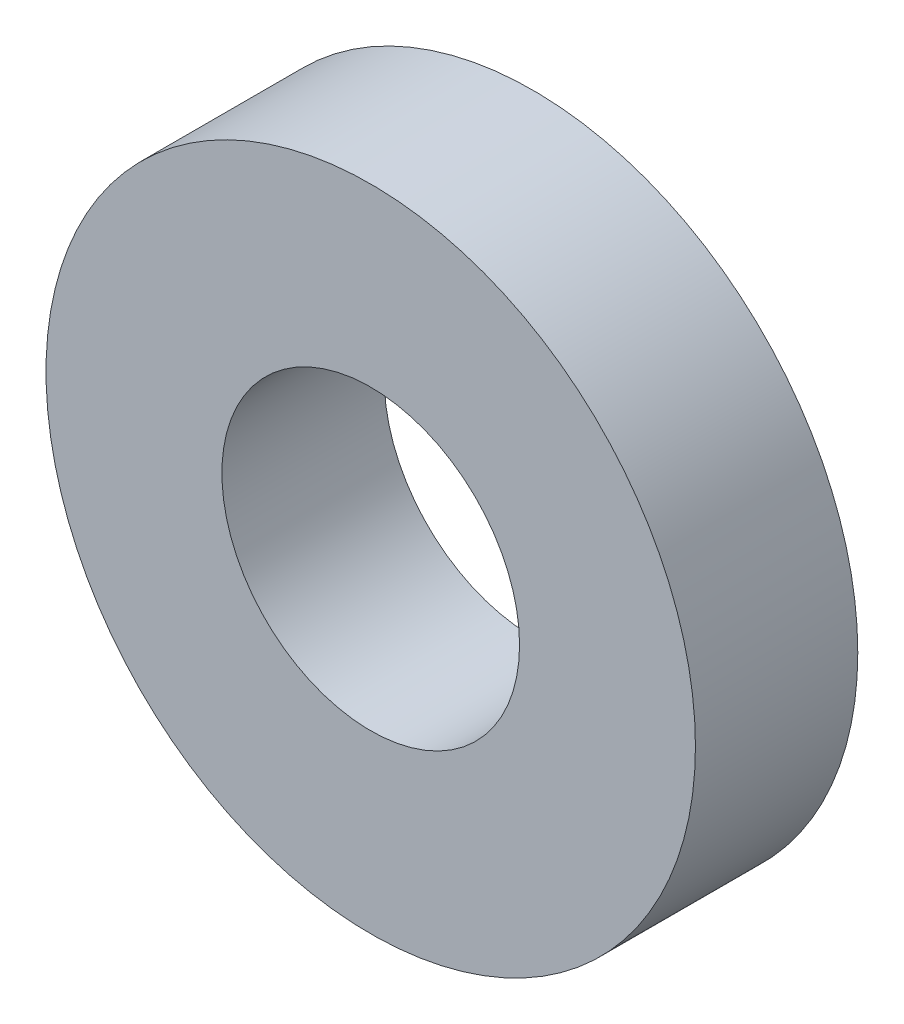
ISO-10303-21;
HEADER;
FILE_DESCRIPTION(('STEP AP214'),'2;1');
FILE_NAME('part.step','',(''),(''),'','','');
FILE_SCHEMA(('AUTOMOTIVE_DESIGN { 1 0 10303 214 1 1 1 1 }'));
ENDSEC;
DATA;
#1=APPLICATION_CONTEXT('core data for automotive mechanical design processes');
#2=APPLICATION_PROTOCOL_DEFINITION('international standard','automotive_design',2000,#1);
#3=PRODUCT_CONTEXT('',#1,'mechanical');
#4=PRODUCT('Part','Part','',(#3));
#5=PRODUCT_RELATED_PRODUCT_CATEGORY('part','',(#4));
#6=PRODUCT_DEFINITION_FORMATION('','',#4);
#7=PRODUCT_DEFINITION_CONTEXT('part definition',#1,'design');
#8=PRODUCT_DEFINITION('design','',#6,#7);
#9=PRODUCT_DEFINITION_SHAPE('','',#8);
#10=(LENGTH_UNIT() NAMED_UNIT(*) SI_UNIT(.MILLI.,.METRE.));
#11=(NAMED_UNIT(*) PLANE_ANGLE_UNIT() SI_UNIT($,.RADIAN.));
#12=(NAMED_UNIT(*) SI_UNIT($,.STERADIAN.) SOLID_ANGLE_UNIT());
#13=UNCERTAINTY_MEASURE_WITH_UNIT(LENGTH_MEASURE(1.E-05),#10,'distance_accuracy_value','');
#14=(GEOMETRIC_REPRESENTATION_CONTEXT(3) GLOBAL_UNCERTAINTY_ASSIGNED_CONTEXT((#13)) GLOBAL_UNIT_ASSIGNED_CONTEXT((#10,
#11,#12)) REPRESENTATION_CONTEXT('',''));
#15=CARTESIAN_POINT('',(0.,0.,0.));
#16=DIRECTION('',(0.,0.,1.));
#17=DIRECTION('',(1.,0.,0.));
#18=AXIS2_PLACEMENT_3D('',#15,#16,#17);
#19=CARTESIAN_POINT('',(0.,0.,12.));
#20=DIRECTION('',(0.,0.,-1.));
#21=DIRECTION('',(-1.,0.,0.));
#22=AXIS2_PLACEMENT_3D('',#19,#20,#21);
#23=CYLINDRICAL_SURFACE('',#22,24.);
#24=CARTESIAN_POINT('',(0.,0.,12.));
#25=DIRECTION('',(0.,0.,1.));
#26=DIRECTION('',(1.,0.,0.));
#27=AXIS2_PLACEMENT_3D('',#24,#25,#26);
#28=CIRCLE('',#27,24.);
#29=CARTESIAN_POINT('',(24.,0.,12.));
#30=VERTEX_POINT('',#29);
#31=EDGE_CURVE('E10',#30,#30,#28,.T.);
#32=ORIENTED_EDGE('',*,*,#31,.F.);
#33=EDGE_LOOP('',(#32));
#34=FACE_BOUND('',#33,.T.);
#35=CARTESIAN_POINT('',(0.,0.,0.));
#36=DIRECTION('',(0.,0.,1.));
#37=DIRECTION('',(1.,0.,0.));
#38=AXIS2_PLACEMENT_3D('',#35,#36,#37);
#39=CIRCLE('',#38,24.);
#40=CARTESIAN_POINT('',(24.,0.,0.));
#41=VERTEX_POINT('',#40);
#42=EDGE_CURVE('E40',#41,#41,#39,.T.);
#43=ORIENTED_EDGE('',*,*,#42,.T.);
#44=EDGE_LOOP('',(#43));
#45=FACE_BOUND('',#44,.T.);
#46=ADVANCED_FACE('F37',(#34,#45),#23,.T.);
#47=CARTESIAN_POINT('',(0.,0.,12.));
#48=DIRECTION('',(0.,0.,1.));
#49=DIRECTION('',(1.,0.,0.));
#50=AXIS2_PLACEMENT_3D('',#47,#48,#49);
#51=PLANE('',#50);
#52=CARTESIAN_POINT('',(0.,0.,12.));
#53=DIRECTION('',(0.,0.,1.));
#54=DIRECTION('',(1.,0.,0.));
#55=AXIS2_PLACEMENT_3D('',#52,#53,#54);
#56=CIRCLE('',#55,11.);
#57=CARTESIAN_POINT('',(11.,0.,12.));
#58=VERTEX_POINT('',#57);
#59=EDGE_CURVE('E49',#58,#58,#56,.T.);
#60=ORIENTED_EDGE('',*,*,#59,.F.);
#61=EDGE_LOOP('',(#60));
#62=FACE_BOUND('',#61,.T.);
#63=ORIENTED_EDGE('',*,*,#31,.T.);
#64=EDGE_LOOP('',(#63));
#65=FACE_BOUND('',#64,.T.);
#66=ADVANCED_FACE('F64',(#62,#65),#51,.T.);
#67=CARTESIAN_POINT('',(0.,0.,0.));
#68=DIRECTION('',(0.,0.,1.));
#69=DIRECTION('',(1.,0.,0.));
#70=AXIS2_PLACEMENT_3D('',#67,#68,#69);
#71=PLANE('',#70);
#72=CARTESIAN_POINT('',(0.,0.,0.));
#73=DIRECTION('',(0.,0.,1.));
#74=DIRECTION('',(1.,0.,0.));
#75=AXIS2_PLACEMENT_3D('',#72,#73,#74);
#76=CIRCLE('',#75,11.);
#77=CARTESIAN_POINT('',(11.,0.,0.));
#78=VERTEX_POINT('',#77);
#79=EDGE_CURVE('E47',#78,#78,#76,.T.);
#80=ORIENTED_EDGE('',*,*,#79,.T.);
#81=EDGE_LOOP('',(#80));
#82=FACE_BOUND('',#81,.T.);
#83=ORIENTED_EDGE('',*,*,#42,.F.);
#84=EDGE_LOOP('',(#83));
#85=FACE_BOUND('',#84,.T.);
#86=ADVANCED_FACE('F55',(#82,#85),#71,.F.);
#87=CARTESIAN_POINT('',(0.,0.,0.));
#88=DIRECTION('',(0.,0.,1.));
#89=DIRECTION('',(1.,0.,0.));
#90=AXIS2_PLACEMENT_3D('',#87,#88,#89);
#91=CYLINDRICAL_SURFACE('',#90,11.);
#92=ORIENTED_EDGE('',*,*,#79,.F.);
#93=EDGE_LOOP('',(#92));
#94=FACE_BOUND('',#93,.T.);
#95=ORIENTED_EDGE('',*,*,#59,.T.);
#96=EDGE_LOOP('',(#95));
#97=FACE_BOUND('',#96,.T.);
#98=ADVANCED_FACE('F58',(#94,#97),#91,.F.);
#99=CLOSED_SHELL('',(#46,#66,#86,#98));
#100=MANIFOLD_SOLID_BREP('B2',#99);
#101=ADVANCED_BREP_SHAPE_REPRESENTATION('',(#18,#100),#14);
#102=SHAPE_DEFINITION_REPRESENTATION(#9,#101);
ENDSEC;
END-ISO-10303-21;
